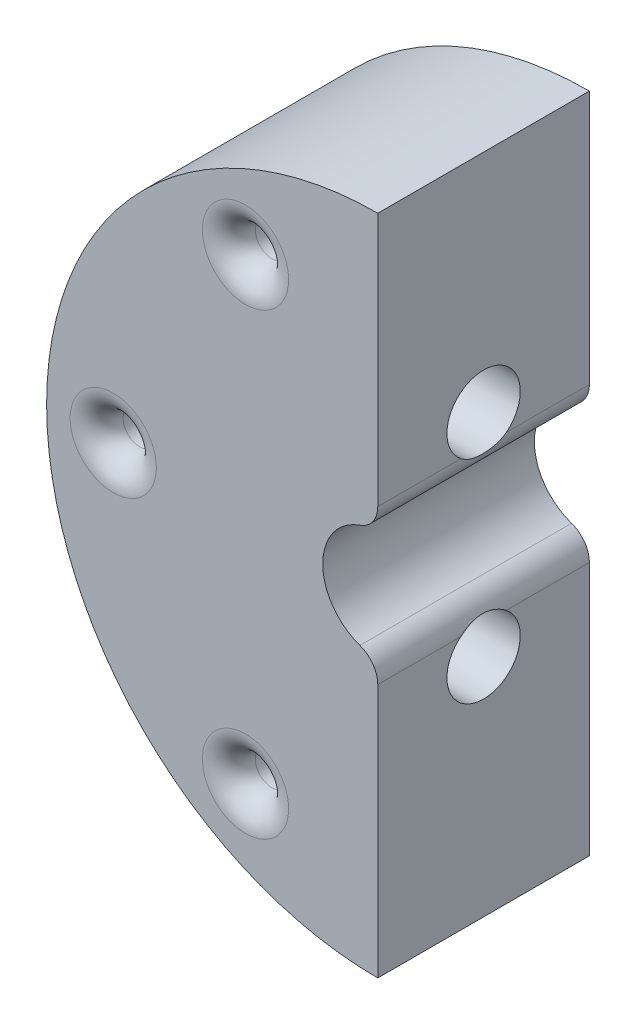
ISO-10303-21;
HEADER;
FILE_DESCRIPTION(('STEP AP214'),'2;1');
FILE_NAME('part.step','',(''),(''),'','','');
FILE_SCHEMA(('AUTOMOTIVE_DESIGN { 1 0 10303 214 1 1 1 1 }'));
ENDSEC;
DATA;
#1=APPLICATION_CONTEXT('core data for automotive mechanical design processes');
#2=APPLICATION_PROTOCOL_DEFINITION('international standard','automotive_design',2000,#1);
#3=PRODUCT_CONTEXT('',#1,'mechanical');
#4=PRODUCT('Part','Part','',(#3));
#5=PRODUCT_RELATED_PRODUCT_CATEGORY('part','',(#4));
#6=PRODUCT_DEFINITION_FORMATION('','',#4);
#7=PRODUCT_DEFINITION_CONTEXT('part definition',#1,'design');
#8=PRODUCT_DEFINITION('design','',#6,#7);
#9=PRODUCT_DEFINITION_SHAPE('','',#8);
#10=(LENGTH_UNIT() NAMED_UNIT(*) SI_UNIT(.MILLI.,.METRE.));
#11=(NAMED_UNIT(*) PLANE_ANGLE_UNIT() SI_UNIT($,.RADIAN.));
#12=(NAMED_UNIT(*) SI_UNIT($,.STERADIAN.) SOLID_ANGLE_UNIT());
#13=UNCERTAINTY_MEASURE_WITH_UNIT(LENGTH_MEASURE(1.E-05),#10,'distance_accuracy_value','');
#14=(GEOMETRIC_REPRESENTATION_CONTEXT(3) GLOBAL_UNCERTAINTY_ASSIGNED_CONTEXT((#13)) GLOBAL_UNIT_ASSIGNED_CONTEXT((#10,
#11,#12)) REPRESENTATION_CONTEXT('',''));
#15=CARTESIAN_POINT('',(0.,0.,0.));
#16=DIRECTION('',(0.,0.,1.));
#17=DIRECTION('',(1.,0.,0.));
#18=AXIS2_PLACEMENT_3D('',#15,#16,#17);
#19=CARTESIAN_POINT('',(0.,0.,6.35));
#20=DIRECTION('',(0.,0.,1.));
#21=DIRECTION('',(1.,0.,0.));
#22=AXIS2_PLACEMENT_3D('',#19,#20,#21);
#23=PLANE('',#22);
#24=CARTESIAN_POINT('',(-3.96874999999998,6.87407664253899,6.35));
#25=DIRECTION('',(0.,0.,1.));
#26=DIRECTION('',(1.,0.,0.));
#27=AXIS2_PLACEMENT_3D('',#24,#25,#26);
#28=CIRCLE('',#27,1.29375);
#29=CARTESIAN_POINT('',(-2.67499999999998,6.87407664253899,6.35));
#30=VERTEX_POINT('',#29);
#31=EDGE_CURVE('E143',#30,#30,#28,.F.);
#32=ORIENTED_EDGE('',*,*,#31,.T.);
#33=EDGE_LOOP('',(#32));
#34=FACE_BOUND('',#33,.T.);
#35=CARTESIAN_POINT('',(-3.96875,-6.874076642539,6.35));
#36=DIRECTION('',(0.,0.,1.));
#37=DIRECTION('',(1.,0.,0.));
#38=AXIS2_PLACEMENT_3D('',#35,#36,#37);
#39=CIRCLE('',#38,1.29375);
#40=CARTESIAN_POINT('',(-2.675,-6.874076642539,6.35));
#41=VERTEX_POINT('',#40);
#42=EDGE_CURVE('E140',#41,#41,#39,.F.);
#43=ORIENTED_EDGE('',*,*,#42,.T.);
#44=EDGE_LOOP('',(#43));
#45=FACE_BOUND('',#44,.T.);
#46=CARTESIAN_POINT('',(-7.9375,0.,6.35));
#47=DIRECTION('',(0.,0.,1.));
#48=DIRECTION('',(1.,0.,0.));
#49=AXIS2_PLACEMENT_3D('',#46,#47,#48);
#50=CIRCLE('',#49,1.29375);
#51=CARTESIAN_POINT('',(-6.64375,0.,6.35));
#52=VERTEX_POINT('',#51);
#53=EDGE_CURVE('E137',#52,#52,#50,.F.);
#54=ORIENTED_EDGE('',*,*,#53,.T.);
#55=EDGE_LOOP('',(#54));
#56=FACE_BOUND('',#55,.T.);
#57=DIRECTION('',(0.,-1.,0.));
#58=VECTOR('',#57,1.);
#59=CARTESIAN_POINT('',(0.,0.,6.35));
#60=LINE('',#59,#58);
#61=CARTESIAN_POINT('',(0.,-2.31230696491621,6.35));
#62=VERTEX_POINT('',#61);
#63=CARTESIAN_POINT('',(0.,-9.9375,6.35));
#64=VERTEX_POINT('',#63);
#65=EDGE_CURVE('E259',#62,#64,#60,.T.);
#66=ORIENTED_EDGE('',*,*,#65,.F.);
#67=CARTESIAN_POINT('',(-0.79375,-2.31230696491621,6.35));
#68=DIRECTION('',(0.,0.,1.));
#69=DIRECTION('',(1.,0.,0.));
#70=AXIS2_PLACEMENT_3D('',#67,#68,#69);
#71=CIRCLE('',#70,0.79375);
#72=CARTESIAN_POINT('',(-0.536038961038961,-1.56155795033302,6.35));
#73=VERTEX_POINT('',#72);
#74=EDGE_CURVE('E243',#62,#73,#71,.T.);
#75=ORIENTED_EDGE('',*,*,#74,.T.);
#76=CARTESIAN_POINT('',(0.,0.,6.35));
#77=DIRECTION('',(0.,0.,1.));
#78=DIRECTION('',(1.,0.,0.));
#79=AXIS2_PLACEMENT_3D('',#76,#77,#78);
#80=CIRCLE('',#79,1.651);
#81=CARTESIAN_POINT('',(-0.536038961038961,1.56155795033302,6.35));
#82=VERTEX_POINT('',#81);
#83=EDGE_CURVE('E234',#82,#73,#80,.T.);
#84=ORIENTED_EDGE('',*,*,#83,.F.);
#85=CARTESIAN_POINT('',(-0.79375,2.31230696491621,6.35));
#86=DIRECTION('',(0.,0.,1.));
#87=DIRECTION('',(1.,0.,0.));
#88=AXIS2_PLACEMENT_3D('',#85,#86,#87);
#89=CIRCLE('',#88,0.79375);
#90=CARTESIAN_POINT('',(0.,2.31230696491621,6.35));
#91=VERTEX_POINT('',#90);
#92=EDGE_CURVE('E241',#82,#91,#89,.T.);
#93=ORIENTED_EDGE('',*,*,#92,.T.);
#94=CARTESIAN_POINT('',(0.,9.9375,6.35));
#95=VERTEX_POINT('',#94);
#96=EDGE_CURVE('E257',#95,#91,#60,.T.);
#97=ORIENTED_EDGE('',*,*,#96,.F.);
#98=CARTESIAN_POINT('',(0.,0.,6.35));
#99=DIRECTION('',(0.,0.,1.));
#100=DIRECTION('',(1.,0.,0.));
#101=AXIS2_PLACEMENT_3D('',#98,#99,#100);
#102=CIRCLE('',#101,9.9375);
#103=EDGE_CURVE('E220',#95,#64,#102,.T.);
#104=ORIENTED_EDGE('',*,*,#103,.T.);
#105=EDGE_LOOP('',(#66,#75,#84,#93,#97,#104));
#106=FACE_BOUND('',#105,.T.);
#107=ADVANCED_FACE('F33',(#34,#45,#56,#106),#23,.T.);
#108=CARTESIAN_POINT('',(0.,0.,0.));
#109=DIRECTION('',(0.,0.,1.));
#110=DIRECTION('',(1.,0.,0.));
#111=AXIS2_PLACEMENT_3D('',#108,#109,#110);
#112=PLANE('',#111);
#113=CARTESIAN_POINT('',(-3.96874999999998,6.87407664253899,0.));
#114=DIRECTION('',(0.,0.,1.));
#115=DIRECTION('',(1.,0.,0.));
#116=AXIS2_PLACEMENT_3D('',#113,#114,#115);
#117=CIRCLE('',#116,1.29375);
#118=CARTESIAN_POINT('',(-2.67499999999998,6.87407664253899,0.));
#119=VERTEX_POINT('',#118);
#120=EDGE_CURVE('E128',#119,#119,#117,.T.);
#121=ORIENTED_EDGE('',*,*,#120,.T.);
#122=EDGE_LOOP('',(#121));
#123=FACE_BOUND('',#122,.T.);
#124=CARTESIAN_POINT('',(-3.96875,-6.874076642539,0.));
#125=DIRECTION('',(0.,0.,1.));
#126=DIRECTION('',(1.,0.,0.));
#127=AXIS2_PLACEMENT_3D('',#124,#125,#126);
#128=CIRCLE('',#127,1.29375);
#129=CARTESIAN_POINT('',(-2.675,-6.874076642539,0.));
#130=VERTEX_POINT('',#129);
#131=EDGE_CURVE('E125',#130,#130,#128,.T.);
#132=ORIENTED_EDGE('',*,*,#131,.T.);
#133=EDGE_LOOP('',(#132));
#134=FACE_BOUND('',#133,.T.);
#135=CARTESIAN_POINT('',(-7.9375,0.,0.));
#136=DIRECTION('',(0.,0.,1.));
#137=DIRECTION('',(1.,0.,0.));
#138=AXIS2_PLACEMENT_3D('',#135,#136,#137);
#139=CIRCLE('',#138,1.29375);
#140=CARTESIAN_POINT('',(-6.64375,0.,0.));
#141=VERTEX_POINT('',#140);
#142=EDGE_CURVE('E119',#141,#141,#139,.T.);
#143=ORIENTED_EDGE('',*,*,#142,.T.);
#144=EDGE_LOOP('',(#143));
#145=FACE_BOUND('',#144,.T.);
#146=CARTESIAN_POINT('',(0.,0.,0.));
#147=DIRECTION('',(0.,0.,1.));
#148=DIRECTION('',(1.,0.,0.));
#149=AXIS2_PLACEMENT_3D('',#146,#147,#148);
#150=CIRCLE('',#149,1.651);
#151=CARTESIAN_POINT('',(-0.536038961038961,1.56155795033302,0.));
#152=VERTEX_POINT('',#151);
#153=CARTESIAN_POINT('',(-0.536038961038961,-1.56155795033302,0.));
#154=VERTEX_POINT('',#153);
#155=EDGE_CURVE('E237',#152,#154,#150,.T.);
#156=ORIENTED_EDGE('',*,*,#155,.T.);
#157=CARTESIAN_POINT('',(-0.79375,-2.31230696491621,0.));
#158=DIRECTION('',(0.,0.,1.));
#159=DIRECTION('',(1.,0.,0.));
#160=AXIS2_PLACEMENT_3D('',#157,#158,#159);
#161=CIRCLE('',#160,0.79375);
#162=CARTESIAN_POINT('',(0.,-2.31230696491621,0.));
#163=VERTEX_POINT('',#162);
#164=EDGE_CURVE('E117',#154,#163,#161,.F.);
#165=ORIENTED_EDGE('',*,*,#164,.T.);
#166=DIRECTION('',(0.,-1.,0.));
#167=VECTOR('',#166,1.);
#168=CARTESIAN_POINT('',(0.,-25.4,0.));
#169=LINE('',#168,#167);
#170=CARTESIAN_POINT('',(0.,-9.9375,0.));
#171=VERTEX_POINT('',#170);
#172=EDGE_CURVE('E258',#163,#171,#169,.T.);
#173=ORIENTED_EDGE('',*,*,#172,.T.);
#174=CARTESIAN_POINT('',(0.,0.,0.));
#175=DIRECTION('',(0.,0.,1.));
#176=DIRECTION('',(1.,0.,0.));
#177=AXIS2_PLACEMENT_3D('',#174,#175,#176);
#178=CIRCLE('',#177,9.9375);
#179=CARTESIAN_POINT('',(0.,9.9375,0.));
#180=VERTEX_POINT('',#179);
#181=EDGE_CURVE('E230',#180,#171,#178,.T.);
#182=ORIENTED_EDGE('',*,*,#181,.F.);
#183=CARTESIAN_POINT('',(0.,2.31230696491621,0.));
#184=VERTEX_POINT('',#183);
#185=EDGE_CURVE('E252',#180,#184,#169,.T.);
#186=ORIENTED_EDGE('',*,*,#185,.T.);
#187=CARTESIAN_POINT('',(-0.79375,2.31230696491621,0.));
#188=DIRECTION('',(0.,0.,1.));
#189=DIRECTION('',(1.,0.,0.));
#190=AXIS2_PLACEMENT_3D('',#187,#188,#189);
#191=CIRCLE('',#190,0.79375);
#192=EDGE_CURVE('E115',#184,#152,#191,.F.);
#193=ORIENTED_EDGE('',*,*,#192,.T.);
#194=EDGE_LOOP('',(#156,#165,#173,#182,#186,#193));
#195=FACE_BOUND('',#194,.T.);
#196=ADVANCED_FACE('F200',(#123,#134,#145,#195),#112,.F.);
#197=CARTESIAN_POINT('',(0.,0.,6.35));
#198=DIRECTION('',(0.,0.,-1.));
#199=DIRECTION('',(-1.,0.,0.));
#200=AXIS2_PLACEMENT_3D('',#197,#198,#199);
#201=CYLINDRICAL_SURFACE('',#200,9.9375);
#202=CARTESIAN_POINT('',(-9.41664915190112,3.175,5.37499999999999));
#203=CARTESIAN_POINT('',(-9.45743492175482,3.05403317268001,5.37499848175562));
#204=CARTESIAN_POINT('',(-9.49587724128903,2.9322537553101,5.36500191023091));
#205=CARTESIAN_POINT('',(-9.56719525833426,2.69045839054531,5.32447413877766));
#206=CARTESIAN_POINT('',(-9.60007113585831,2.57044238623813,5.29394360305528));
#207=CARTESIAN_POINT('',(-9.65987123753614,2.33570119698492,5.21241041097622));
#208=CARTESIAN_POINT('',(-9.68678371188321,2.22098680356358,5.16136788623193));
#209=CARTESIAN_POINT('',(-9.73460745776271,2.00100207046301,5.03980968036871));
#210=CARTESIAN_POINT('',(-9.75551926312674,1.89573089126954,4.96929573256262));
#211=CARTESIAN_POINT('',(-9.79121849036812,1.70158441957311,4.81330447105662));
#212=CARTESIAN_POINT('',(-9.80618555586981,1.61228208220563,4.72839902861066));
#213=CARTESIAN_POINT('',(-9.83166385907538,1.44884440537012,4.54449525951227));
#214=CARTESIAN_POINT('',(-9.84217535611035,1.37470818330629,4.44549775351987));
#215=CARTESIAN_POINT('',(-9.85945921185549,1.24468497164575,4.23743481951444));
#216=CARTESIAN_POINT('',(-9.86627207398541,1.18860315717692,4.12849437286149));
#217=CARTESIAN_POINT('',(-9.87707248596502,1.09524679537473,3.90270275765228));
#218=CARTESIAN_POINT('',(-9.88106000837715,1.05797243068612,3.78585151228442));
#219=CARTESIAN_POINT('',(-9.88676969477051,1.00322476996165,3.54708834224574));
#220=CARTESIAN_POINT('',(-9.88848338505484,0.985825574328238,3.42515922462151));
#221=CARTESIAN_POINT('',(-9.88989295856568,0.971584507818578,3.18009322610074));
#222=CARTESIAN_POINT('',(-9.88958879761534,0.974743087013948,3.05695631882098));
#223=CARTESIAN_POINT('',(-9.88690823180741,1.00156413318519,2.81261514569826));
#224=CARTESIAN_POINT('',(-9.88452614849355,1.02528278471931,2.69141710327094));
#225=CARTESIAN_POINT('',(-9.87731037284914,1.09260350195426,2.45475005223457));
#226=CARTESIAN_POINT('',(-9.87247668828301,1.13620550468281,2.33928102548252));
#227=CARTESIAN_POINT('',(-9.85973307832381,1.24192879827811,2.11749872687808));
#228=CARTESIAN_POINT('',(-9.85182662458761,1.30402917100578,2.01117528720168));
#229=CARTESIAN_POINT('',(-9.83215773717377,1.44485872584842,1.81058587502424));
#230=CARTESIAN_POINT('',(-9.82039553701026,1.52358690083732,1.71631917281599));
#231=CARTESIAN_POINT('',(-9.79229287005093,1.69481002336479,1.54287794426334));
#232=CARTESIAN_POINT('',(-9.77597254273186,1.78724359124217,1.46363954630444));
#233=CARTESIAN_POINT('',(-9.7381157533855,1.98316527121196,1.32185353642192));
#234=CARTESIAN_POINT('',(-9.71657956292983,2.0866528076064,1.25930505586931));
#235=CARTESIAN_POINT('',(-9.66792550437994,2.30158012663208,1.15223458087923));
#236=CARTESIAN_POINT('',(-9.64079758936651,2.41303398394601,1.10774546784212));
#237=CARTESIAN_POINT('',(-9.58104936272902,2.64030399735175,1.0376537649096));
#238=CARTESIAN_POINT('',(-9.5484284440105,2.75612063452456,1.01205326429506));
#239=CARTESIAN_POINT('',(-9.47714951021247,2.99218523308261,0.97928000211499));
#240=CARTESIAN_POINT('',(-9.43834480912975,3.11246482101125,0.972658594056144));
#241=CARTESIAN_POINT('',(-9.35631850530638,3.35099059449124,0.97880439035733));
#242=CARTESIAN_POINT('',(-9.31309565124492,3.46923619283088,0.991577101840432));
#243=CARTESIAN_POINT('',(-9.22061524564616,3.70831534850382,1.0369400408131));
#244=CARTESIAN_POINT('',(-9.17114892146865,3.82883968147507,1.07073242781896));
#245=CARTESIAN_POINT('',(-9.07037233666705,4.06182107736328,1.15781583287798));
#246=CARTESIAN_POINT('',(-9.01906130413592,4.17427470275601,1.21111510115606));
#247=CARTESIAN_POINT('',(-8.91335651457743,4.39567710470637,1.3399537007833));
#248=CARTESIAN_POINT('',(-8.85897798679527,4.50392894057849,1.41670836925631));
#249=CARTESIAN_POINT('',(-8.75339333632725,4.70584854918454,1.58939080765291));
#250=CARTESIAN_POINT('',(-8.70218857998956,4.79951006650405,1.68532676127859));
#251=CARTESIAN_POINT('',(-8.60684675077504,4.96844373250991,1.89382622303835));
#252=CARTESIAN_POINT('',(-8.56265376486878,5.04386416981894,2.00624282754593));
#253=CARTESIAN_POINT('',(-8.48478373971238,5.17379208865958,2.24584505856394));
#254=CARTESIAN_POINT('',(-8.45109199851981,5.22832883244978,2.37300969196242));
#255=CARTESIAN_POINT('',(-8.40148096764463,5.30763073631285,2.62124245102943));
#256=CARTESIAN_POINT('',(-8.38384890256633,5.33529568911179,2.74103638559376));
#257=CARTESIAN_POINT('',(-8.36154129214356,5.37019505875342,2.98470369432971));
#258=CARTESIAN_POINT('',(-8.35685113284481,5.37745251984027,3.10857230725108));
#259=CARTESIAN_POINT('',(-8.36067123915019,5.3715046744136,3.33863078566921));
#260=CARTESIAN_POINT('',(-8.36747118035374,5.36095088561408,3.44493144551989));
#261=CARTESIAN_POINT('',(-8.39048371537123,5.32486086464085,3.65389194232076));
#262=CARTESIAN_POINT('',(-8.40669709104438,5.29932338795304,3.75655147609539));
#263=CARTESIAN_POINT('',(-8.44722898137053,5.23446989469568,3.95575311216358));
#264=CARTESIAN_POINT('',(-8.47155340587826,5.19514383043663,4.0522906926729));
#265=CARTESIAN_POINT('',(-8.52663425729756,5.1042367900453,4.23739812808942));
#266=CARTESIAN_POINT('',(-8.55739277615113,5.05265182738584,4.32596537814431));
#267=CARTESIAN_POINT('',(-8.62768837376694,4.93176965675076,4.50418260341144));
#268=CARTESIAN_POINT('',(-8.66783882329945,4.86107855381056,4.59264325864148));
#269=CARTESIAN_POINT('',(-8.75188214507069,4.7080878882183,4.75685127201446));
#270=CARTESIAN_POINT('',(-8.79577757960813,4.62578035206168,4.83258981885086));
#271=CARTESIAN_POINT('',(-8.89156859576115,4.4391845693325,4.9799527519352));
#272=CARTESIAN_POINT('',(-8.94373032707811,4.33343081013914,5.04955535141718));
#273=CARTESIAN_POINT('',(-9.04788509601669,4.11153215411505,5.1696991220403));
#274=CARTESIAN_POINT('',(-9.09987813455639,3.99538731393459,5.22024039709243));
#275=CARTESIAN_POINT('',(-9.19797552865204,3.76375314542254,5.29802109285863));
#276=CARTESIAN_POINT('',(-9.24423630676144,3.6487982436737,5.32665555250423));
#277=CARTESIAN_POINT('',(-9.3333176580886,3.41449515909461,5.36514275330265));
#278=CARTESIAN_POINT('',(-9.37613932857978,3.29514839538529,5.3750015079723));
#279=CARTESIAN_POINT('',(-9.41664915190112,3.175,5.37499999999999));
#280=B_SPLINE_CURVE_WITH_KNOTS('',3,(#202,#203,#204,#205,#206,#207,#208,#209,#210,#211,#212,
#213,#214,#215,#216,#217,#218,#219,#220,#221,#222,#223,#224,#225,#226,#227,#228,#229,#230,#231,
#232,#233,#234,#235,#236,#237,#238,#239,#240,#241,#242,#243,#244,#245,#246,#247,#248,#249,#250,
#251,#252,#253,#254,#255,#256,#257,#258,#259,#260,#261,#262,#263,#264,#265,#266,#267,#268,#269,
#270,#271,#272,#273,#274,#275,#276,#277,#278,#279),.UNSPECIFIED.,.T.,.F.,(4,2,2,2,2,2,2,2,2,2,2,
2,2,2,2,2,2,2,2,2,2,2,2,2,2,2,2,2,2,2,2,2,2,2,2,2,2,2,4),(0.,0.382561514676479,
0.765110655342105,1.14840696684189,1.5316691689517,1.90225851208963,2.27282628255069,
2.63924965539817,3.00567658662351,3.37346525016039,3.74126196572608,4.11006694013939,
4.47887074652388,4.84725907897969,5.21562510499068,5.58238862493468,5.94913305289729,
6.3165422636588,6.68399210768579,7.06201343922036,7.44014213316178,7.84218330509629,
8.24439471287673,8.67261663231303,9.10102164415499,9.52581718208078,9.95001529872024,
10.3203822162107,10.6903307452086,11.0099099380236,11.329515678183,11.6493547994791,
11.9692980733926,12.3283239180454,12.6875974070478,13.0966179570747,13.5056362773326,
13.8857312324595,14.2657044295986),.UNSPECIFIED.);
#281=CARTESIAN_POINT('',(-9.41664915190112,3.175,5.37499999999999));
#282=VERTEX_POINT('',#281);
#283=EDGE_CURVE('E37',#282,#282,#280,.T.);
#284=ORIENTED_EDGE('',*,*,#283,.T.);
#285=EDGE_LOOP('',(#284));
#286=FACE_BOUND('',#285,.T.);
#287=CARTESIAN_POINT('',(-9.41664915190112,-3.175,5.375));
#288=CARTESIAN_POINT('',(-9.37186036803344,-3.30782820954697,5.37499653846217));
#289=CARTESIAN_POINT('',(-9.32422392847239,-3.4397410721908,5.36294047537473));
#290=CARTESIAN_POINT('',(-9.22489417173034,-3.69789458720497,5.31598896893529));
#291=CARTESIAN_POINT('',(-9.17319719995989,-3.82412996523367,5.28107273863546));
#292=CARTESIAN_POINT('',(-9.06792679035409,-4.06744913254336,5.1900356044848));
#293=CARTESIAN_POINT('',(-9.01435808951527,-4.18455389959994,5.13396514573934));
#294=CARTESIAN_POINT('',(-8.90757498180474,-4.40729921929204,5.00207428868644));
#295=CARTESIAN_POINT('',(-8.85436069835466,-4.51293595611339,4.92624734506654));
#296=CARTESIAN_POINT('',(-8.74943019627526,-4.71323245154544,4.7535683409107));
#297=CARTESIAN_POINT('',(-8.69781435327797,-4.80744021937089,4.65612794137771));
#298=CARTESIAN_POINT('',(-8.60155955911166,-4.97761405827304,4.44349061800705));
#299=CARTESIAN_POINT('',(-8.55691225347296,-5.05360203232908,4.32831529072015));
#300=CARTESIAN_POINT('',(-8.48727926355793,-5.16948091151043,4.10978201572027));
#301=CARTESIAN_POINT('',(-8.46012899626686,-5.21363311067542,4.00936681859115));
#302=CARTESIAN_POINT('',(-8.41457660533161,-5.28684001395298,3.80130867119107));
#303=CARTESIAN_POINT('',(-8.39616696625544,-5.31590769016008,3.69367202135351));
#304=CARTESIAN_POINT('',(-8.36966067303921,-5.35754764271258,3.47347800668375));
#305=CARTESIAN_POINT('',(-8.36160966683208,-5.37004691345482,3.36090110703403));
#306=CARTESIAN_POINT('',(-8.3567959454911,-5.37753601388589,3.13492207254346));
#307=CARTESIAN_POINT('',(-8.36003155818028,-5.37252843731376,3.02152006243158));
#308=CARTESIAN_POINT('',(-8.37679507518236,-5.34634575791044,2.80598140957819));
#309=CARTESIAN_POINT('',(-8.38954624127662,-5.32639037697548,2.70363078871711));
#310=CARTESIAN_POINT('',(-8.42336562994398,-5.27274257905513,2.50406052950575));
#311=CARTESIAN_POINT('',(-8.44443541666803,-5.23904757856877,2.40684186001647));
#312=CARTESIAN_POINT('',(-8.49460290266883,-5.15732726219033,2.21490000711296));
#313=CARTESIAN_POINT('',(-8.52404413452516,-5.10867926906357,2.12053404584538));
#314=CARTESIAN_POINT('',(-8.58856628198079,-4.99944566736727,1.94112660561908));
#315=CARTESIAN_POINT('',(-8.62364970429079,-4.93885475008677,1.85608929957141));
#316=CARTESIAN_POINT('',(-8.70283732427399,-4.79811491995753,1.68523780902917));
#317=CARTESIAN_POINT('',(-8.74751732382597,-4.71641725665264,1.60096600350834));
#318=CARTESIAN_POINT('',(-8.83955203643503,-4.5415855697198,1.44698621061476));
#319=CARTESIAN_POINT('',(-8.88690835527732,-4.4484446399624,1.37728708723367));
#320=CARTESIAN_POINT('',(-8.98805150999264,-4.2407211290924,1.24598541502271));
#321=CARTESIAN_POINT('',(-9.04192296708735,-4.12490781241117,1.18638364916356));
#322=CARTESIAN_POINT('',(-9.14802633241661,-3.8839229064219,1.08829051737898));
#323=CARTESIAN_POINT('',(-9.20025784525689,-3.75874908450493,1.04980420614512));
#324=CARTESIAN_POINT('',(-9.30212582588133,-3.49917293472465,0.994886764339647));
#325=CARTESIAN_POINT('',(-9.35167709440102,-3.36462606767083,0.978973130515468));
#326=CARTESIAN_POINT('',(-9.44501644772028,-3.09292276357484,0.972341466693642));
#327=CARTESIAN_POINT('',(-9.48880696619265,-2.95576745669829,0.981612761061947));
#328=CARTESIAN_POINT('',(-9.5668890690958,-2.69189977421534,1.02479438329997));
#329=CARTESIAN_POINT('',(-9.60159675357582,-2.56506014568506,1.05716964968717));
#330=CARTESIAN_POINT('',(-9.66428172282887,-2.31772098298968,1.14466584019825));
#331=CARTESIAN_POINT('',(-9.69226180089535,-2.19721883380407,1.19977729838271));
#332=CARTESIAN_POINT('',(-9.73994741288866,-1.97470216034049,1.32712883962882));
#333=CARTESIAN_POINT('',(-9.76007703379906,-1.87199244577865,1.39799917585082));
#334=CARTESIAN_POINT('',(-9.79503200547603,-1.679533350022,1.55663013288443));
#335=CARTESIAN_POINT('',(-9.80985817872567,-1.58978196047919,1.64438813143019));
#336=CARTESIAN_POINT('',(-9.83462654934743,-1.42847058776892,1.83168250716558));
#337=CARTESIAN_POINT('',(-9.8446898270127,-1.35648479602886,1.93083680669224));
#338=CARTESIAN_POINT('',(-9.86131024005728,-1.22986134761214,2.13992874956267));
#339=CARTESIAN_POINT('',(-9.86786742721995,-1.17522343472008,2.24986623361535));
#340=CARTESIAN_POINT('',(-9.87820126546108,-1.08495270412998,2.47737661120696));
#341=CARTESIAN_POINT('',(-9.88197849673771,-1.049315921178,2.59494790593347));
#342=CARTESIAN_POINT('',(-9.88728598617552,-0.998074325968976,2.83442767841784));
#343=CARTESIAN_POINT('',(-9.88881619032208,-0.982469995258303,2.95633626036438));
#344=CARTESIAN_POINT('',(-9.8898780260798,-0.97172552046279,3.20156172440559));
#345=CARTESIAN_POINT('',(-9.88940145959593,-0.976669318893477,3.32488232680868));
#346=CARTESIAN_POINT('',(-9.8863516856771,-1.00706769894717,3.56894445685182));
#347=CARTESIAN_POINT('',(-9.88377845409425,-1.03252251680128,3.68968595477116));
#348=CARTESIAN_POINT('',(-9.87613626685099,-1.10321979173714,3.92523780404955));
#349=CARTESIAN_POINT('',(-9.8710656406014,-1.14847549201279,4.04004412829502));
#350=CARTESIAN_POINT('',(-9.85777853945774,-1.25741983881623,4.26035028278321));
#351=CARTESIAN_POINT('',(-9.84956219059421,-1.32110774684934,4.36585048565894));
#352=CARTESIAN_POINT('',(-9.82922814743049,-1.46471995876521,4.56420300562334));
#353=CARTESIAN_POINT('',(-9.81712317175041,-1.54459102179801,4.6570951701863));
#354=CARTESIAN_POINT('',(-9.78823245215315,-1.71817710908405,4.82802833397869));
#355=CARTESIAN_POINT('',(-9.77144677491654,-1.81189193611213,4.90606954474595));
#356=CARTESIAN_POINT('',(-9.73265408494625,-2.00984521226678,5.04502571528879));
#357=CARTESIAN_POINT('',(-9.71066306094772,-2.11405088529967,5.10599189485527));
#358=CARTESIAN_POINT('',(-9.66114705874467,-2.32988855128487,5.20972785472575));
#359=CARTESIAN_POINT('',(-9.63362376075408,-2.44151828259584,5.25250314754683));
#360=CARTESIAN_POINT('',(-9.5763588272072,-2.65675063575601,5.31571024258309));
#361=CARTESIAN_POINT('',(-9.54716086862098,-2.75995125448628,5.33802864637991));
#362=CARTESIAN_POINT('',(-9.48476943264875,-2.9672866499099,5.36767650610766));
#363=CARTESIAN_POINT('',(-9.45157508719188,-3.07142162499586,5.37500269927949));
#364=CARTESIAN_POINT('',(-9.41664915190112,-3.175,5.375));
#365=B_SPLINE_CURVE_WITH_KNOTS('',3,(#287,#288,#289,#290,#291,#292,#293,#294,#295,#296,#297,
#298,#299,#300,#301,#302,#303,#304,#305,#306,#307,#308,#309,#310,#311,#312,#313,#314,#315,#316,
#317,#318,#319,#320,#321,#322,#323,#324,#325,#326,#327,#328,#329,#330,#331,#332,#333,#334,#335,
#336,#337,#338,#339,#340,#341,#342,#343,#344,#345,#346,#347,#348,#349,#350,#351,#352,#353,#354,
#355,#356,#357,#358,#359,#360,#361,#362,#363,#364),.UNSPECIFIED.,.T.,.F.,(4,2,2,2,2,2,2,2,2,2,2,
2,2,2,2,2,2,2,2,2,2,2,2,2,2,2,2,2,2,2,2,2,2,2,2,2,2,2,4),(0.,0.420108785919866,
0.840600111944782,1.26009499339511,1.67972903037686,2.11261479344526,2.54497752276775,
2.88257637757983,3.21988442757741,3.55867387615882,3.89741313328272,4.21116775919475,
4.52498140853437,4.85421159413629,5.18358845617208,5.55885459504202,5.93434833377769,
6.3552863292816,6.77632504648197,7.20686848694163,7.63722945291264,8.04137878269306,
8.44536001930777,8.82269186979372,9.19996517652378,9.5670501429217,9.93412968749275,
10.3011325979967,10.6681443304666,11.0366568372406,11.4051735883362,11.7739371878649,
12.1426860147592,12.5102408405895,12.8777904305557,13.2442253799053,13.610549206535,
13.9380754043288,14.2656728741656),.UNSPECIFIED.);
#366=CARTESIAN_POINT('',(-9.41664915190112,-3.175,5.375));
#367=VERTEX_POINT('',#366);
#368=EDGE_CURVE('E164',#367,#367,#365,.T.);
#369=ORIENTED_EDGE('',*,*,#368,.T.);
#370=EDGE_LOOP('',(#369));
#371=FACE_BOUND('',#370,.T.);
#372=ORIENTED_EDGE('',*,*,#103,.F.);
#373=DIRECTION('',(0.,0.,-1.));
#374=VECTOR('',#373,1.);
#375=CARTESIAN_POINT('',(0.,9.9375,6.35));
#376=LINE('',#375,#374);
#377=EDGE_CURVE('E222',#95,#180,#376,.T.);
#378=ORIENTED_EDGE('',*,*,#377,.T.);
#379=ORIENTED_EDGE('',*,*,#181,.T.);
#380=DIRECTION('',(0.,0.,-1.));
#381=VECTOR('',#380,1.);
#382=CARTESIAN_POINT('',(0.,-9.9375,6.35));
#383=LINE('',#382,#381);
#384=EDGE_CURVE('E225',#171,#64,#383,.F.);
#385=ORIENTED_EDGE('',*,*,#384,.T.);
#386=EDGE_LOOP('',(#372,#378,#379,#385));
#387=FACE_BOUND('',#386,.T.);
#388=ADVANCED_FACE('F196',(#286,#371,#387),#201,.T.);
#389=CARTESIAN_POINT('',(0.,0.,6.35));
#390=DIRECTION('',(0.,0.,-1.));
#391=DIRECTION('',(-1.,0.,0.));
#392=AXIS2_PLACEMENT_3D('',#389,#390,#391);
#393=CYLINDRICAL_SURFACE('',#392,1.651);
#394=ORIENTED_EDGE('',*,*,#83,.T.);
#395=DIRECTION('',(0.,0.,-1.));
#396=VECTOR('',#395,1.);
#397=CARTESIAN_POINT('',(-0.536038961038961,-1.56155795033302,6.35));
#398=LINE('',#397,#396);
#399=EDGE_CURVE('E247',#73,#154,#398,.T.);
#400=ORIENTED_EDGE('',*,*,#399,.T.);
#401=ORIENTED_EDGE('',*,*,#155,.F.);
#402=DIRECTION('',(0.,0.,-1.));
#403=VECTOR('',#402,1.);
#404=CARTESIAN_POINT('',(-0.536038961038961,1.56155795033302,6.35));
#405=LINE('',#404,#403);
#406=EDGE_CURVE('E245',#152,#82,#405,.F.);
#407=ORIENTED_EDGE('',*,*,#406,.T.);
#408=EDGE_LOOP('',(#394,#400,#401,#407));
#409=FACE_BOUND('',#408,.T.);
#410=ADVANCED_FACE('F192',(#409),#393,.F.);
#411=CARTESIAN_POINT('',(-7.9375,0.,6.35));
#412=DIRECTION('',(0.,0.,-1.));
#413=DIRECTION('',(-1.,0.,0.));
#414=AXIS2_PLACEMENT_3D('',#411,#412,#413);
#415=CYLINDRICAL_SURFACE('',#414,0.500000000000001);
#416=CARTESIAN_POINT('',(-7.9375,0.,0.79375));
#417=DIRECTION('',(0.,0.,1.));
#418=DIRECTION('',(1.,0.,0.));
#419=AXIS2_PLACEMENT_3D('',#416,#417,#418);
#420=CIRCLE('',#419,0.500000000000001);
#421=CARTESIAN_POINT('',(-7.4375,0.,0.79375));
#422=VERTEX_POINT('',#421);
#423=EDGE_CURVE('E155',#422,#422,#420,.F.);
#424=ORIENTED_EDGE('',*,*,#423,.T.);
#425=EDGE_LOOP('',(#424));
#426=FACE_BOUND('',#425,.T.);
#427=CARTESIAN_POINT('',(-7.9375,0.,5.55625));
#428=DIRECTION('',(0.,0.,1.));
#429=DIRECTION('',(1.,0.,0.));
#430=AXIS2_PLACEMENT_3D('',#427,#428,#429);
#431=CIRCLE('',#430,0.500000000000001);
#432=CARTESIAN_POINT('',(-7.4375,0.,5.55625));
#433=VERTEX_POINT('',#432);
#434=EDGE_CURVE('E152',#433,#433,#431,.T.);
#435=ORIENTED_EDGE('',*,*,#434,.T.);
#436=EDGE_LOOP('',(#435));
#437=FACE_BOUND('',#436,.T.);
#438=ADVANCED_FACE('F188',(#426,#437),#415,.F.);
#439=CARTESIAN_POINT('',(-3.96874999999998,6.87407664253899,6.35));
#440=DIRECTION('',(0.,0.,-1.));
#441=DIRECTION('',(-1.,0.,0.));
#442=AXIS2_PLACEMENT_3D('',#439,#440,#441);
#443=CYLINDRICAL_SURFACE('',#442,0.5);
#444=CARTESIAN_POINT('',(-3.96874999999998,6.87407664253899,0.79375));
#445=DIRECTION('',(0.,0.,1.));
#446=DIRECTION('',(1.,0.,0.));
#447=AXIS2_PLACEMENT_3D('',#444,#445,#446);
#448=CIRCLE('',#447,0.5);
#449=CARTESIAN_POINT('',(-3.46874999999998,6.87407664253899,0.79375));
#450=VERTEX_POINT('',#449);
#451=EDGE_CURVE('E134',#450,#450,#448,.F.);
#452=ORIENTED_EDGE('',*,*,#451,.T.);
#453=EDGE_LOOP('',(#452));
#454=FACE_BOUND('',#453,.T.);
#455=CARTESIAN_POINT('',(-3.96874999999998,6.87407664253899,5.55625));
#456=DIRECTION('',(0.,0.,1.));
#457=DIRECTION('',(1.,0.,0.));
#458=AXIS2_PLACEMENT_3D('',#455,#456,#457);
#459=CIRCLE('',#458,0.5);
#460=CARTESIAN_POINT('',(-3.46874999999998,6.87407664253899,5.55625));
#461=VERTEX_POINT('',#460);
#462=EDGE_CURVE('E131',#461,#461,#459,.T.);
#463=ORIENTED_EDGE('',*,*,#462,.T.);
#464=EDGE_LOOP('',(#463));
#465=FACE_BOUND('',#464,.T.);
#466=ADVANCED_FACE('F184',(#454,#465),#443,.F.);
#467=CARTESIAN_POINT('',(-3.96875,-6.874076642539,6.35));
#468=DIRECTION('',(0.,0.,-1.));
#469=DIRECTION('',(-1.,0.,0.));
#470=AXIS2_PLACEMENT_3D('',#467,#468,#469);
#471=CYLINDRICAL_SURFACE('',#470,0.500000000000001);
#472=CARTESIAN_POINT('',(-3.96875,-6.874076642539,0.79375));
#473=DIRECTION('',(0.,0.,1.));
#474=DIRECTION('',(1.,0.,0.));
#475=AXIS2_PLACEMENT_3D('',#472,#473,#474);
#476=CIRCLE('',#475,0.500000000000001);
#477=CARTESIAN_POINT('',(-3.46875,-6.874076642539,0.79375));
#478=VERTEX_POINT('',#477);
#479=EDGE_CURVE('E149',#478,#478,#476,.F.);
#480=ORIENTED_EDGE('',*,*,#479,.T.);
#481=EDGE_LOOP('',(#480));
#482=FACE_BOUND('',#481,.T.);
#483=CARTESIAN_POINT('',(-3.96875,-6.874076642539,5.55625));
#484=DIRECTION('',(0.,0.,1.));
#485=DIRECTION('',(1.,0.,0.));
#486=AXIS2_PLACEMENT_3D('',#483,#484,#485);
#487=CIRCLE('',#486,0.500000000000001);
#488=CARTESIAN_POINT('',(-3.46875,-6.874076642539,5.55625));
#489=VERTEX_POINT('',#488);
#490=EDGE_CURVE('E146',#489,#489,#487,.T.);
#491=ORIENTED_EDGE('',*,*,#490,.T.);
#492=EDGE_LOOP('',(#491));
#493=FACE_BOUND('',#492,.T.);
#494=ADVANCED_FACE('F181',(#482,#493),#471,.F.);
#495=CARTESIAN_POINT('',(0.,0.,0.));
#496=DIRECTION('',(-1.,0.,0.));
#497=DIRECTION('',(0.,0.,1.));
#498=AXIS2_PLACEMENT_3D('',#495,#496,#497);
#499=PLANE('',#498);
#500=DIRECTION('',(0.,0.,1.));
#501=VECTOR('',#500,1.);
#502=CARTESIAN_POINT('',(0.,-2.31230696491621,6.35));
#503=LINE('',#502,#501);
#504=CARTESIAN_POINT('',(0.,-2.31230696491621,2.49253335083837));
#505=VERTEX_POINT('',#504);
#506=EDGE_CURVE('E232',#163,#505,#503,.T.);
#507=ORIENTED_EDGE('',*,*,#506,.T.);
#508=CARTESIAN_POINT('',(0.,-3.175,3.175));
#509=DIRECTION('',(-1.,0.,0.));
#510=DIRECTION('',(0.,0.,1.));
#511=AXIS2_PLACEMENT_3D('',#508,#509,#510);
#512=CIRCLE('',#511,1.1);
#513=CARTESIAN_POINT('',(0.,-2.31230696491621,3.85746664916163));
#514=VERTEX_POINT('',#513);
#515=EDGE_CURVE('E58',#505,#514,#512,.T.);
#516=ORIENTED_EDGE('',*,*,#515,.T.);
#517=EDGE_CURVE('E229',#514,#62,#503,.T.);
#518=ORIENTED_EDGE('',*,*,#517,.T.);
#519=ORIENTED_EDGE('',*,*,#65,.T.);
#520=ORIENTED_EDGE('',*,*,#384,.F.);
#521=ORIENTED_EDGE('',*,*,#172,.F.);
#522=EDGE_LOOP('',(#507,#516,#518,#519,#520,#521));
#523=FACE_BOUND('',#522,.T.);
#524=ADVANCED_FACE('F180',(#523),#499,.F.);
#525=DIRECTION('',(0.,0.,1.));
#526=VECTOR('',#525,1.);
#527=CARTESIAN_POINT('',(0.,2.31230696491621,0.));
#528=LINE('',#527,#526);
#529=CARTESIAN_POINT('',(0.,2.31230696491621,3.85746664916163));
#530=VERTEX_POINT('',#529);
#531=EDGE_CURVE('E110',#91,#530,#528,.F.);
#532=ORIENTED_EDGE('',*,*,#531,.T.);
#533=CARTESIAN_POINT('',(0.,3.175,3.175));
#534=DIRECTION('',(-1.,0.,0.));
#535=DIRECTION('',(0.,0.,1.));
#536=AXIS2_PLACEMENT_3D('',#533,#534,#535);
#537=CIRCLE('',#536,1.1);
#538=CARTESIAN_POINT('',(0.,2.31230696491621,2.49253335083837));
#539=VERTEX_POINT('',#538);
#540=EDGE_CURVE('E51',#530,#539,#537,.T.);
#541=ORIENTED_EDGE('',*,*,#540,.T.);
#542=EDGE_CURVE('E107',#539,#184,#528,.F.);
#543=ORIENTED_EDGE('',*,*,#542,.T.);
#544=ORIENTED_EDGE('',*,*,#185,.F.);
#545=ORIENTED_EDGE('',*,*,#377,.F.);
#546=ORIENTED_EDGE('',*,*,#96,.T.);
#547=EDGE_LOOP('',(#532,#541,#543,#544,#545,#546));
#548=FACE_BOUND('',#547,.T.);
#549=ADVANCED_FACE('F106',(#548),#499,.F.);
#550=CARTESIAN_POINT('',(-0.79375,-2.31230696491621,6.35));
#551=DIRECTION('',(0.,0.,-1.));
#552=DIRECTION('',(-1.,0.,0.));
#553=AXIS2_PLACEMENT_3D('',#550,#551,#552);
#554=CYLINDRICAL_SURFACE('',#553,0.79375);
#555=CARTESIAN_POINT('',(0.,-2.31230696491621,2.49253335083837));
#556=CARTESIAN_POINT('',(-7.43143425234498E-06,-2.29126077753582,2.51913015816656));
#557=CARTESIAN_POINT('',(-0.000836799634948094,-2.27146642300722,2.5466871381002));
#558=CARTESIAN_POINT('',(-0.00360072336538565,-2.234532826673,2.60345402167608));
#559=CARTESIAN_POINT('',(-0.00553461012645187,-2.21739198618145,2.63266291547701));
#560=CARTESIAN_POINT('',(-0.009971393896847,-2.18588255184023,2.69251516018292));
#561=CARTESIAN_POINT('',(-0.0124745979786325,-2.17151546182758,2.72315927809511));
#562=CARTESIAN_POINT('',(-0.017578446079344,-2.14566517443541,2.78562408244302));
#563=CARTESIAN_POINT('',(-0.0201790930291511,-2.13418206388022,2.81744480426819));
#564=CARTESIAN_POINT('',(-0.0269657425191371,-2.10632937406573,2.90744871636318));
#565=CARTESIAN_POINT('',(-0.0307924703226672,-2.09320638503706,2.96670642694178));
#566=CARTESIAN_POINT('',(-0.0356629162408631,-2.07689734168796,3.0865575836813));
#567=CARTESIAN_POINT('',(-0.0367121768132169,-2.07369149547078,3.14714812603051));
#568=CARTESIAN_POINT('',(-0.0355972092486983,-2.07726257113507,3.2676371701562));
#569=CARTESIAN_POINT('',(-0.0334524825756328,-2.08397890933651,3.32753763969378));
#570=CARTESIAN_POINT('',(-0.0269043805902952,-2.10705679332445,3.44539638527011));
#571=CARTESIAN_POINT('',(-0.022497296062643,-2.12343418534562,3.50335130474347));
#572=CARTESIAN_POINT('',(-0.0136324555166228,-2.1644187613236,3.61317185594626));
#573=CARTESIAN_POINT('',(-0.00918683080751611,-2.18860266281152,3.66519568172682));
#574=CARTESIAN_POINT('',(-0.0040775066768443,-2.2307281225266,3.73995057010212));
#575=CARTESIAN_POINT('',(-0.00263452346545007,-2.245737521952,3.7643127357592));
#576=CARTESIAN_POINT('',(-0.000597073925163779,-2.2776347273822,3.81183206032508));
#577=CARTESIAN_POINT('',(-3.13776855090564E-06,-2.29452369996559,3.83498845762621));
#578=CARTESIAN_POINT('',(0.,-2.31230696491621,3.85746664916163));
#579=B_SPLINE_CURVE_WITH_KNOTS('',3,(#555,#556,#557,#558,#559,#560,#561,#562,#563,#564,#565,
#566,#567,#568,#569,#570,#571,#572,#573,#574,#575,#576,#577,#578),.UNSPECIFIED.,.F.,.F.,(4,2,2,
2,2,2,2,2,2,2,2,4),(0.,0.101669856169745,0.203278217997869,0.304941514807224,0.406607871897994,
0.588130945618414,0.769291514588611,0.949350500524963,1.12970564687131,1.30157847846983,
1.38744447467447,1.47336406498219),.UNSPECIFIED.);
#580=EDGE_CURVE('E46',#505,#514,#579,.T.);
#581=ORIENTED_EDGE('',*,*,#580,.F.);
#582=ORIENTED_EDGE('',*,*,#506,.F.);
#583=ORIENTED_EDGE('',*,*,#164,.F.);
#584=ORIENTED_EDGE('',*,*,#399,.F.);
#585=ORIENTED_EDGE('',*,*,#74,.F.);
#586=ORIENTED_EDGE('',*,*,#517,.F.);
#587=EDGE_LOOP('',(#581,#582,#583,#584,#585,#586));
#588=FACE_BOUND('',#587,.T.);
#589=ADVANCED_FACE('F168',(#588),#554,.T.);
#590=CARTESIAN_POINT('',(-0.79375,2.31230696491621,6.35));
#591=DIRECTION('',(0.,0.,-1.));
#592=DIRECTION('',(-1.,0.,0.));
#593=AXIS2_PLACEMENT_3D('',#590,#591,#592);
#594=CYLINDRICAL_SURFACE('',#593,0.79375);
#595=CARTESIAN_POINT('',(0.,2.31230696491621,3.85746664916163));
#596=CARTESIAN_POINT('',(-7.43143425235959E-06,2.29126077753582,3.83086984183344));
#597=CARTESIAN_POINT('',(-0.000836799634948097,2.27146642300722,3.8033128618998));
#598=CARTESIAN_POINT('',(-0.00360072336538563,2.234532826673,3.74654597832392));
#599=CARTESIAN_POINT('',(-0.00553461012645183,2.21739198618145,3.71733708452299));
#600=CARTESIAN_POINT('',(-0.00997139389684699,2.18588255184023,3.65748483981708));
#601=CARTESIAN_POINT('',(-0.0124745979786325,2.17151546182758,3.62684072190489));
#602=CARTESIAN_POINT('',(-0.0175784460793441,2.14566517443541,3.56437591755698));
#603=CARTESIAN_POINT('',(-0.0201790930291512,2.13418206388022,3.53255519573181));
#604=CARTESIAN_POINT('',(-0.0269657425191372,2.10632937406572,3.44255128363682));
#605=CARTESIAN_POINT('',(-0.0307924703226672,2.09320638503706,3.38329357305822));
#606=CARTESIAN_POINT('',(-0.0356629162408632,2.07689734168796,3.2634424163187));
#607=CARTESIAN_POINT('',(-0.0367121768132172,2.07369149547078,3.20285187396949));
#608=CARTESIAN_POINT('',(-0.0355972092486987,2.07726257113506,3.08236282984381));
#609=CARTESIAN_POINT('',(-0.0334524825756331,2.08397890933651,3.02246236030622));
#610=CARTESIAN_POINT('',(-0.0269043805902955,2.10705679332445,2.90460361472989));
#611=CARTESIAN_POINT('',(-0.0224972960626434,2.12343418534561,2.84664869525653));
#612=CARTESIAN_POINT('',(-0.0136324555166231,2.16441876132359,2.73682814405374));
#613=CARTESIAN_POINT('',(-0.00918683080751621,2.18860266281151,2.68480431827318));
#614=CARTESIAN_POINT('',(-0.00407750667684432,2.2307281225266,2.61004942989788));
#615=CARTESIAN_POINT('',(-0.00263452346545011,2.245737521952,2.5856872642408));
#616=CARTESIAN_POINT('',(-0.000597073925163827,2.2776347273822,2.53816793967491));
#617=CARTESIAN_POINT('',(-3.13776855094097E-06,2.29452369996559,2.51501154237379));
#618=CARTESIAN_POINT('',(0.,2.31230696491621,2.49253335083836));
#619=B_SPLINE_CURVE_WITH_KNOTS('',3,(#595,#596,#597,#598,#599,#600,#601,#602,#603,#604,#605,
#606,#607,#608,#609,#610,#611,#612,#613,#614,#615,#616,#617,#618),.UNSPECIFIED.,.F.,.F.,(4,2,2,
2,2,2,2,2,2,2,2,4),(0.,0.101669856169745,0.203278217997869,0.304941514807225,0.406607871897993,
0.588130945618414,0.769291514588611,0.949350500524962,1.12970564687131,1.30157847846983,
1.38744447467447,1.4733640649822),.UNSPECIFIED.);
#620=EDGE_CURVE('E11',#530,#539,#619,.T.);
#621=ORIENTED_EDGE('',*,*,#620,.F.);
#622=ORIENTED_EDGE('',*,*,#531,.F.);
#623=ORIENTED_EDGE('',*,*,#92,.F.);
#624=ORIENTED_EDGE('',*,*,#406,.F.);
#625=ORIENTED_EDGE('',*,*,#192,.F.);
#626=ORIENTED_EDGE('',*,*,#542,.F.);
#627=EDGE_LOOP('',(#621,#622,#623,#624,#625,#626));
#628=FACE_BOUND('',#627,.T.);
#629=ADVANCED_FACE('F113',(#628),#594,.T.);
#630=CARTESIAN_POINT('',(-3.96874999999998,6.87407664253899,0.79375));
#631=DIRECTION('',(0.,0.,1.));
#632=DIRECTION('',(1.,0.,0.));
#633=AXIS2_PLACEMENT_3D('',#630,#631,#632);
#634=TOROIDAL_SURFACE('',#633,1.29375,0.79375);
#635=ORIENTED_EDGE('',*,*,#451,.F.);
#636=EDGE_LOOP('',(#635));
#637=FACE_BOUND('',#636,.T.);
#638=ORIENTED_EDGE('',*,*,#120,.F.);
#639=EDGE_LOOP('',(#638));
#640=FACE_BOUND('',#639,.T.);
#641=ADVANCED_FACE('F309',(#637,#640),#634,.T.);
#642=CARTESIAN_POINT('',(-3.96874999999998,6.87407664253899,5.55625));
#643=DIRECTION('',(0.,0.,1.));
#644=DIRECTION('',(1.,0.,0.));
#645=AXIS2_PLACEMENT_3D('',#642,#643,#644);
#646=TOROIDAL_SURFACE('',#645,1.29375,0.79375);
#647=ORIENTED_EDGE('',*,*,#31,.F.);
#648=EDGE_LOOP('',(#647));
#649=FACE_BOUND('',#648,.T.);
#650=ORIENTED_EDGE('',*,*,#462,.F.);
#651=EDGE_LOOP('',(#650));
#652=FACE_BOUND('',#651,.T.);
#653=ADVANCED_FACE('F312',(#649,#652),#646,.T.);
#654=CARTESIAN_POINT('',(-3.96875,-6.874076642539,0.79375));
#655=DIRECTION('',(0.,0.,1.));
#656=DIRECTION('',(1.,0.,0.));
#657=AXIS2_PLACEMENT_3D('',#654,#655,#656);
#658=TOROIDAL_SURFACE('',#657,1.29375,0.79375);
#659=ORIENTED_EDGE('',*,*,#479,.F.);
#660=EDGE_LOOP('',(#659));
#661=FACE_BOUND('',#660,.T.);
#662=ORIENTED_EDGE('',*,*,#131,.F.);
#663=EDGE_LOOP('',(#662));
#664=FACE_BOUND('',#663,.T.);
#665=ADVANCED_FACE('F316',(#661,#664),#658,.T.);
#666=CARTESIAN_POINT('',(-3.96875,-6.874076642539,5.55625));
#667=DIRECTION('',(0.,0.,1.));
#668=DIRECTION('',(1.,0.,0.));
#669=AXIS2_PLACEMENT_3D('',#666,#667,#668);
#670=TOROIDAL_SURFACE('',#669,1.29375,0.79375);
#671=ORIENTED_EDGE('',*,*,#42,.F.);
#672=EDGE_LOOP('',(#671));
#673=FACE_BOUND('',#672,.T.);
#674=ORIENTED_EDGE('',*,*,#490,.F.);
#675=EDGE_LOOP('',(#674));
#676=FACE_BOUND('',#675,.T.);
#677=ADVANCED_FACE('F320',(#673,#676),#670,.T.);
#678=CARTESIAN_POINT('',(-7.9375,0.,0.79375));
#679=DIRECTION('',(0.,0.,1.));
#680=DIRECTION('',(1.,0.,0.));
#681=AXIS2_PLACEMENT_3D('',#678,#679,#680);
#682=TOROIDAL_SURFACE('',#681,1.29375,0.79375);
#683=ORIENTED_EDGE('',*,*,#423,.F.);
#684=EDGE_LOOP('',(#683));
#685=FACE_BOUND('',#684,.T.);
#686=ORIENTED_EDGE('',*,*,#142,.F.);
#687=EDGE_LOOP('',(#686));
#688=FACE_BOUND('',#687,.T.);
#689=ADVANCED_FACE('F323',(#685,#688),#682,.T.);
#690=CARTESIAN_POINT('',(-7.9375,0.,5.55625));
#691=DIRECTION('',(0.,0.,1.));
#692=DIRECTION('',(1.,0.,0.));
#693=AXIS2_PLACEMENT_3D('',#690,#691,#692);
#694=TOROIDAL_SURFACE('',#693,1.29375,0.79375);
#695=ORIENTED_EDGE('',*,*,#53,.F.);
#696=EDGE_LOOP('',(#695));
#697=FACE_BOUND('',#696,.T.);
#698=ORIENTED_EDGE('',*,*,#434,.F.);
#699=EDGE_LOOP('',(#698));
#700=FACE_BOUND('',#699,.T.);
#701=ADVANCED_FACE('F35',(#697,#700),#694,.T.);
#702=CARTESIAN_POINT('',(-9.9375,-3.175,3.175));
#703=DIRECTION('',(-1.,0.,0.));
#704=DIRECTION('',(0.,0.,1.));
#705=AXIS2_PLACEMENT_3D('',#702,#703,#704);
#706=CYLINDRICAL_SURFACE('',#705,2.2);
#707=CARTESIAN_POINT('',(-4.7625,-3.175,3.175));
#708=DIRECTION('',(-1.,0.,0.));
#709=DIRECTION('',(0.,0.,1.));
#710=AXIS2_PLACEMENT_3D('',#707,#708,#709);
#711=CIRCLE('',#710,2.2);
#712=CARTESIAN_POINT('',(-4.7625,-3.175,5.375));
#713=VERTEX_POINT('',#712);
#714=EDGE_CURVE('E276',#713,#713,#711,.T.);
#715=ORIENTED_EDGE('',*,*,#714,.F.);
#716=EDGE_LOOP('',(#715));
#717=FACE_BOUND('',#716,.T.);
#718=ORIENTED_EDGE('',*,*,#368,.F.);
#719=EDGE_LOOP('',(#718));
#720=FACE_BOUND('',#719,.T.);
#721=ADVANCED_FACE('F177',(#717,#720),#706,.F.);
#722=CARTESIAN_POINT('',(-9.9375,-3.175,3.175));
#723=DIRECTION('',(-1.,0.,0.));
#724=DIRECTION('',(0.,0.,1.));
#725=AXIS2_PLACEMENT_3D('',#722,#723,#724);
#726=CYLINDRICAL_SURFACE('',#725,1.1);
#727=ORIENTED_EDGE('',*,*,#580,.T.);
#728=ORIENTED_EDGE('',*,*,#515,.F.);
#729=EDGE_LOOP('',(#727,#728));
#730=FACE_BOUND('',#729,.T.);
#731=CARTESIAN_POINT('',(-4.7625,-3.175,3.175));
#732=DIRECTION('',(-1.,0.,0.));
#733=DIRECTION('',(0.,0.,1.));
#734=AXIS2_PLACEMENT_3D('',#731,#732,#733);
#735=CIRCLE('',#734,1.1);
#736=CARTESIAN_POINT('',(-4.7625,-3.175,4.275));
#737=VERTEX_POINT('',#736);
#738=EDGE_CURVE('E274',#737,#737,#735,.T.);
#739=ORIENTED_EDGE('',*,*,#738,.T.);
#740=EDGE_LOOP('',(#739));
#741=FACE_BOUND('',#740,.T.);
#742=ADVANCED_FACE('F171',(#730,#741),#726,.F.);
#743=CARTESIAN_POINT('',(-4.7625,-2.075,3.175));
#744=DIRECTION('',(1.,0.,0.));
#745=DIRECTION('',(0.,0.,-1.));
#746=AXIS2_PLACEMENT_3D('',#743,#744,#745);
#747=PLANE('',#746);
#748=ORIENTED_EDGE('',*,*,#738,.F.);
#749=EDGE_LOOP('',(#748));
#750=FACE_BOUND('',#749,.T.);
#751=ORIENTED_EDGE('',*,*,#714,.T.);
#752=EDGE_LOOP('',(#751));
#753=FACE_BOUND('',#752,.T.);
#754=ADVANCED_FACE('F176',(#750,#753),#747,.F.);
#755=CARTESIAN_POINT('',(-9.9375,3.175,3.175));
#756=DIRECTION('',(-1.,0.,0.));
#757=DIRECTION('',(0.,0.,1.));
#758=AXIS2_PLACEMENT_3D('',#755,#756,#757);
#759=CYLINDRICAL_SURFACE('',#758,2.2);
#760=CARTESIAN_POINT('',(-4.7625,3.175,3.175));
#761=DIRECTION('',(-1.,0.,0.));
#762=DIRECTION('',(0.,0.,1.));
#763=AXIS2_PLACEMENT_3D('',#760,#761,#762);
#764=CIRCLE('',#763,2.2);
#765=CARTESIAN_POINT('',(-4.7625,3.175,5.375));
#766=VERTEX_POINT('',#765);
#767=EDGE_CURVE('E283',#766,#766,#764,.T.);
#768=ORIENTED_EDGE('',*,*,#767,.F.);
#769=EDGE_LOOP('',(#768));
#770=FACE_BOUND('',#769,.T.);
#771=ORIENTED_EDGE('',*,*,#283,.F.);
#772=EDGE_LOOP('',(#771));
#773=FACE_BOUND('',#772,.T.);
#774=ADVANCED_FACE('F289',(#770,#773),#759,.F.);
#775=CARTESIAN_POINT('',(-9.9375,3.175,3.175));
#776=DIRECTION('',(-1.,0.,0.));
#777=DIRECTION('',(0.,0.,1.));
#778=AXIS2_PLACEMENT_3D('',#775,#776,#777);
#779=CYLINDRICAL_SURFACE('',#778,1.1);
#780=ORIENTED_EDGE('',*,*,#620,.T.);
#781=ORIENTED_EDGE('',*,*,#540,.F.);
#782=EDGE_LOOP('',(#780,#781));
#783=FACE_BOUND('',#782,.T.);
#784=CARTESIAN_POINT('',(-4.7625,3.175,3.175));
#785=DIRECTION('',(-1.,0.,0.));
#786=DIRECTION('',(0.,0.,1.));
#787=AXIS2_PLACEMENT_3D('',#784,#785,#786);
#788=CIRCLE('',#787,1.1);
#789=CARTESIAN_POINT('',(-4.7625,3.175,4.275));
#790=VERTEX_POINT('',#789);
#791=EDGE_CURVE('E111',#790,#790,#788,.T.);
#792=ORIENTED_EDGE('',*,*,#791,.T.);
#793=EDGE_LOOP('',(#792));
#794=FACE_BOUND('',#793,.T.);
#795=ADVANCED_FACE('F99',(#783,#794),#779,.F.);
#796=CARTESIAN_POINT('',(-4.7625,4.275,3.175));
#797=DIRECTION('',(1.,0.,0.));
#798=DIRECTION('',(0.,0.,-1.));
#799=AXIS2_PLACEMENT_3D('',#796,#797,#798);
#800=PLANE('',#799);
#801=ORIENTED_EDGE('',*,*,#791,.F.);
#802=EDGE_LOOP('',(#801));
#803=FACE_BOUND('',#802,.T.);
#804=ORIENTED_EDGE('',*,*,#767,.T.);
#805=EDGE_LOOP('',(#804));
#806=FACE_BOUND('',#805,.T.);
#807=ADVANCED_FACE('F287',(#803,#806),#800,.F.);
#808=CLOSED_SHELL('',(#107,#196,#388,#410,#438,#466,#494,#524,#549,#589,#629,#641,#653,#665,
#677,#689,#701,#721,#742,#754,#774,#795,#807));
#809=MANIFOLD_SOLID_BREP('B2',#808);
#810=ADVANCED_BREP_SHAPE_REPRESENTATION('',(#18,#809),#14);
#811=SHAPE_DEFINITION_REPRESENTATION(#9,#810);
ENDSEC;
END-ISO-10303-21;
